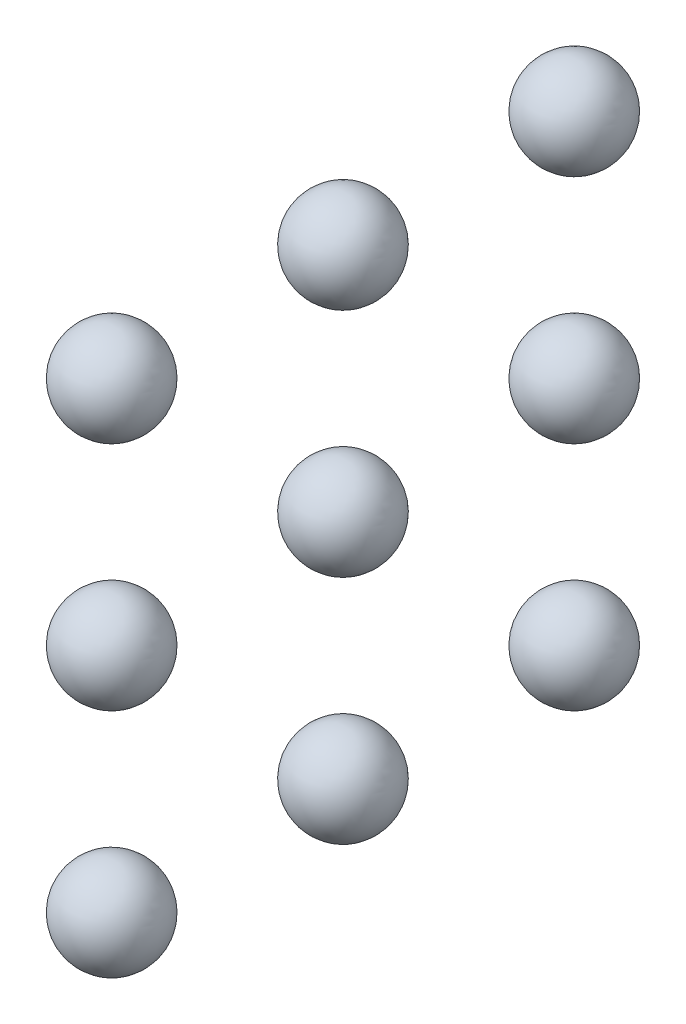
ISO-10303-21;
HEADER;
FILE_DESCRIPTION(('STEP AP214'),'2;1');
FILE_NAME('part.step','',(''),(''),'','','');
FILE_SCHEMA(('AUTOMOTIVE_DESIGN { 1 0 10303 214 1 1 1 1 }'));
ENDSEC;
DATA;
#1=APPLICATION_CONTEXT('core data for automotive mechanical design processes');
#2=APPLICATION_PROTOCOL_DEFINITION('international standard','automotive_design',2000,#1);
#3=PRODUCT_CONTEXT('',#1,'mechanical');
#4=PRODUCT('Part','Part','',(#3));
#5=PRODUCT_RELATED_PRODUCT_CATEGORY('part','',(#4));
#6=PRODUCT_DEFINITION_FORMATION('','',#4);
#7=PRODUCT_DEFINITION_CONTEXT('part definition',#1,'design');
#8=PRODUCT_DEFINITION('design','',#6,#7);
#9=PRODUCT_DEFINITION_SHAPE('','',#8);
#10=(LENGTH_UNIT() NAMED_UNIT(*) SI_UNIT(.MILLI.,.METRE.));
#11=(NAMED_UNIT(*) PLANE_ANGLE_UNIT() SI_UNIT($,.RADIAN.));
#12=(NAMED_UNIT(*) SI_UNIT($,.STERADIAN.) SOLID_ANGLE_UNIT());
#13=UNCERTAINTY_MEASURE_WITH_UNIT(LENGTH_MEASURE(1.E-05),#10,'distance_accuracy_value','');
#14=(GEOMETRIC_REPRESENTATION_CONTEXT(3) GLOBAL_UNCERTAINTY_ASSIGNED_CONTEXT((#13)) GLOBAL_UNIT_ASSIGNED_CONTEXT((#10,
#11,#12)) REPRESENTATION_CONTEXT('',''));
#15=CARTESIAN_POINT('',(0.,0.,0.));
#16=DIRECTION('',(0.,0.,1.));
#17=DIRECTION('',(1.,0.,0.));
#18=AXIS2_PLACEMENT_3D('',#15,#16,#17);
#19=CARTESIAN_POINT('',(0.,30.,30.));
#20=DIRECTION('',(0.,1.,0.));
#21=DIRECTION('',(1.,0.,0.));
#22=AXIS2_PLACEMENT_3D('',#19,#20,#21);
#23=SPHERICAL_SURFACE('',#22,3.);
#24=CARTESIAN_POINT('',(0.,33.,30.));
#25=VERTEX_POINT('',#24);
#26=VERTEX_LOOP('',#25);
#27=FACE_BOUND('',#26,.T.);
#28=ADVANCED_FACE('F40',(#27),#23,.T.);
#29=CLOSED_SHELL('',(#28));
#30=MANIFOLD_SOLID_BREP('B2',#29);
#31=CARTESIAN_POINT('',(0.,30.,15.));
#32=DIRECTION('',(0.,1.,0.));
#33=DIRECTION('',(1.,0.,0.));
#34=AXIS2_PLACEMENT_3D('',#31,#32,#33);
#35=SPHERICAL_SURFACE('',#34,3.);
#36=CARTESIAN_POINT('',(0.,33.,15.));
#37=VERTEX_POINT('',#36);
#38=VERTEX_LOOP('',#37);
#39=FACE_BOUND('',#38,.T.);
#40=ADVANCED_FACE('F59',(#39),#35,.T.);
#41=CLOSED_SHELL('',(#40));
#42=MANIFOLD_SOLID_BREP('B6',#41);
#43=CARTESIAN_POINT('',(0.,30.,0.));
#44=DIRECTION('',(0.,1.,0.));
#45=DIRECTION('',(1.,0.,0.));
#46=AXIS2_PLACEMENT_3D('',#43,#44,#45);
#47=SPHERICAL_SURFACE('',#46,3.);
#48=CARTESIAN_POINT('',(0.,33.,0.));
#49=VERTEX_POINT('',#48);
#50=VERTEX_LOOP('',#49);
#51=FACE_BOUND('',#50,.T.);
#52=ADVANCED_FACE('F78',(#51),#47,.T.);
#53=CLOSED_SHELL('',(#52));
#54=MANIFOLD_SOLID_BREP('B36',#53);
#55=CARTESIAN_POINT('',(0.,15.,30.));
#56=DIRECTION('',(0.,1.,0.));
#57=DIRECTION('',(1.,0.,0.));
#58=AXIS2_PLACEMENT_3D('',#55,#56,#57);
#59=SPHERICAL_SURFACE('',#58,3.);
#60=CARTESIAN_POINT('',(0.,18.,30.));
#61=VERTEX_POINT('',#60);
#62=VERTEX_LOOP('',#61);
#63=FACE_BOUND('',#62,.T.);
#64=ADVANCED_FACE('F97',(#63),#59,.T.);
#65=CLOSED_SHELL('',(#64));
#66=MANIFOLD_SOLID_BREP('B55',#65);
#67=CARTESIAN_POINT('',(0.,15.,15.));
#68=DIRECTION('',(0.,1.,0.));
#69=DIRECTION('',(1.,0.,0.));
#70=AXIS2_PLACEMENT_3D('',#67,#68,#69);
#71=SPHERICAL_SURFACE('',#70,3.);
#72=CARTESIAN_POINT('',(0.,18.,15.));
#73=VERTEX_POINT('',#72);
#74=VERTEX_LOOP('',#73);
#75=FACE_BOUND('',#74,.T.);
#76=ADVANCED_FACE('F116',(#75),#71,.T.);
#77=CLOSED_SHELL('',(#76));
#78=MANIFOLD_SOLID_BREP('B74',#77);
#79=CARTESIAN_POINT('',(0.,15.,0.));
#80=DIRECTION('',(0.,1.,0.));
#81=DIRECTION('',(1.,0.,0.));
#82=AXIS2_PLACEMENT_3D('',#79,#80,#81);
#83=SPHERICAL_SURFACE('',#82,3.);
#84=CARTESIAN_POINT('',(0.,18.,0.));
#85=VERTEX_POINT('',#84);
#86=VERTEX_LOOP('',#85);
#87=FACE_BOUND('',#86,.T.);
#88=ADVANCED_FACE('F135',(#87),#83,.T.);
#89=CLOSED_SHELL('',(#88));
#90=MANIFOLD_SOLID_BREP('B93',#89);
#91=CARTESIAN_POINT('',(0.,0.,30.));
#92=DIRECTION('',(0.,1.,0.));
#93=DIRECTION('',(1.,0.,0.));
#94=AXIS2_PLACEMENT_3D('',#91,#92,#93);
#95=SPHERICAL_SURFACE('',#94,3.);
#96=CARTESIAN_POINT('',(0.,3.,30.));
#97=VERTEX_POINT('',#96);
#98=VERTEX_LOOP('',#97);
#99=FACE_BOUND('',#98,.T.);
#100=ADVANCED_FACE('F154',(#99),#95,.T.);
#101=CLOSED_SHELL('',(#100));
#102=MANIFOLD_SOLID_BREP('B112',#101);
#103=CARTESIAN_POINT('',(0.,0.,15.));
#104=DIRECTION('',(0.,1.,0.));
#105=DIRECTION('',(1.,0.,0.));
#106=AXIS2_PLACEMENT_3D('',#103,#104,#105);
#107=SPHERICAL_SURFACE('',#106,3.);
#108=CARTESIAN_POINT('',(0.,3.,15.));
#109=VERTEX_POINT('',#108);
#110=VERTEX_LOOP('',#109);
#111=FACE_BOUND('',#110,.T.);
#112=ADVANCED_FACE('F172',(#111),#107,.T.);
#113=CLOSED_SHELL('',(#112));
#114=MANIFOLD_SOLID_BREP('B131',#113);
#115=CARTESIAN_POINT('',(0.,0.,0.));
#116=DIRECTION('',(0.,1.,0.));
#117=DIRECTION('',(1.,0.,0.));
#118=AXIS2_PLACEMENT_3D('',#115,#116,#117);
#119=SPHERICAL_SURFACE('',#118,3.);
#120=CARTESIAN_POINT('',(0.,3.,0.));
#121=VERTEX_POINT('',#120);
#122=VERTEX_LOOP('',#121);
#123=FACE_BOUND('',#122,.T.);
#124=ADVANCED_FACE('F185',(#123),#119,.T.);
#125=CLOSED_SHELL('',(#124));
#126=MANIFOLD_SOLID_BREP('B150',#125);
#127=ADVANCED_BREP_SHAPE_REPRESENTATION('',(#18,#30,#42,#54,#66,#78,#90,#102,#114,#126),#14);
#128=SHAPE_DEFINITION_REPRESENTATION(#9,#127);
ENDSEC;
END-ISO-10303-21;
